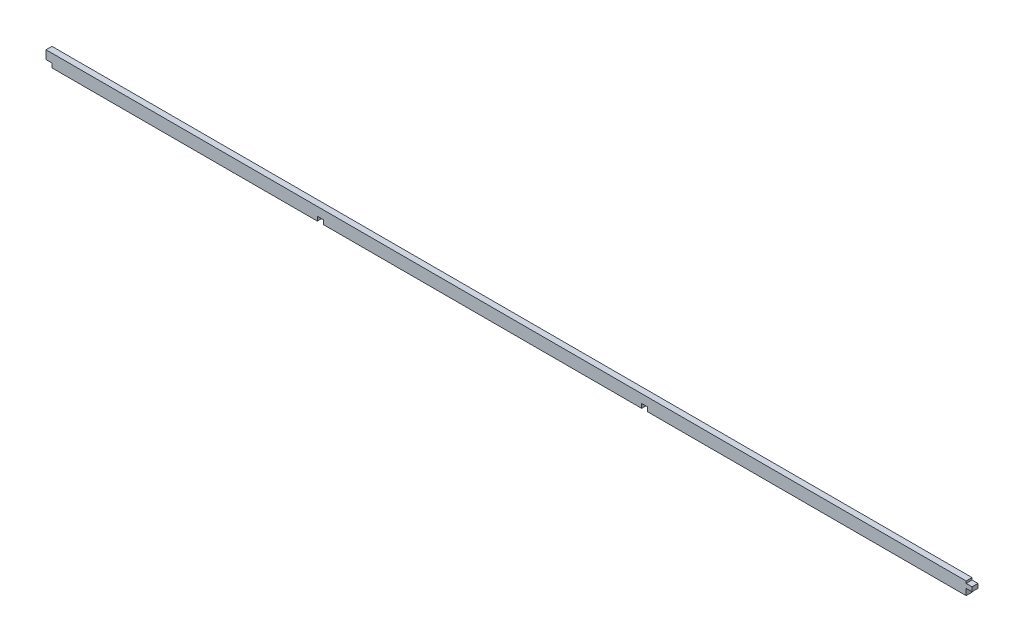
ISO-10303-21;
HEADER;
FILE_DESCRIPTION(('STEP AP214'),'2;1');
FILE_NAME('part.step','',(''),(''),'','','');
FILE_SCHEMA(('AUTOMOTIVE_DESIGN { 1 0 10303 214 1 1 1 1 }'));
ENDSEC;
DATA;
#1=APPLICATION_CONTEXT('core data for automotive mechanical design processes');
#2=APPLICATION_PROTOCOL_DEFINITION('international standard','automotive_design',2000,#1);
#3=PRODUCT_CONTEXT('',#1,'mechanical');
#4=PRODUCT('Part','Part','',(#3));
#5=PRODUCT_RELATED_PRODUCT_CATEGORY('part','',(#4));
#6=PRODUCT_DEFINITION_FORMATION('','',#4);
#7=PRODUCT_DEFINITION_CONTEXT('part definition',#1,'design');
#8=PRODUCT_DEFINITION('design','',#6,#7);
#9=PRODUCT_DEFINITION_SHAPE('','',#8);
#10=(LENGTH_UNIT() NAMED_UNIT(*) SI_UNIT(.MILLI.,.METRE.));
#11=(NAMED_UNIT(*) PLANE_ANGLE_UNIT() SI_UNIT($,.RADIAN.));
#12=(NAMED_UNIT(*) SI_UNIT($,.STERADIAN.) SOLID_ANGLE_UNIT());
#13=UNCERTAINTY_MEASURE_WITH_UNIT(LENGTH_MEASURE(1.E-05),#10,'distance_accuracy_value','');
#14=(GEOMETRIC_REPRESENTATION_CONTEXT(3) GLOBAL_UNCERTAINTY_ASSIGNED_CONTEXT((#13)) GLOBAL_UNIT_ASSIGNED_CONTEXT((#10,
#11,#12)) REPRESENTATION_CONTEXT('',''));
#15=CARTESIAN_POINT('',(0.,0.,0.));
#16=DIRECTION('',(0.,0.,1.));
#17=DIRECTION('',(1.,0.,0.));
#18=AXIS2_PLACEMENT_3D('',#15,#16,#17);
#19=CARTESIAN_POINT('',(433.4,0.,1.4));
#20=DIRECTION('',(-1.,0.,0.));
#21=DIRECTION('',(0.,0.,1.));
#22=AXIS2_PLACEMENT_3D('',#19,#20,#21);
#23=PLANE('',#22);
#24=DIRECTION('',(0.,1.,0.));
#25=VECTOR('',#24,1.);
#26=CARTESIAN_POINT('',(433.4,0.,-1.4));
#27=LINE('',#26,#25);
#28=CARTESIAN_POINT('',(433.4,-1.,-1.4));
#29=VERTEX_POINT('',#28);
#30=CARTESIAN_POINT('',(433.4,0.,-1.4));
#31=VERTEX_POINT('',#30);
#32=EDGE_CURVE('E188',#29,#31,#27,.T.);
#33=ORIENTED_EDGE('',*,*,#32,.T.);
#34=DIRECTION('',(0.,0.,-1.));
#35=VECTOR('',#34,1.);
#36=CARTESIAN_POINT('',(433.4,0.,1.4));
#37=LINE('',#36,#35);
#38=CARTESIAN_POINT('',(433.4,0.,1.4));
#39=VERTEX_POINT('',#38);
#40=EDGE_CURVE('E11',#39,#31,#37,.T.);
#41=ORIENTED_EDGE('',*,*,#40,.F.);
#42=DIRECTION('',(0.,1.,0.));
#43=VECTOR('',#42,1.);
#44=CARTESIAN_POINT('',(433.4,0.,1.4));
#45=LINE('',#44,#43);
#46=CARTESIAN_POINT('',(433.4,-1.,1.4));
#47=VERTEX_POINT('',#46);
#48=EDGE_CURVE('E222',#47,#39,#45,.T.);
#49=ORIENTED_EDGE('',*,*,#48,.F.);
#50=DIRECTION('',(0.,0.,-1.));
#51=VECTOR('',#50,1.);
#52=CARTESIAN_POINT('',(433.4,-1.,1.4));
#53=LINE('',#52,#51);
#54=EDGE_CURVE('E184',#47,#29,#53,.T.);
#55=ORIENTED_EDGE('',*,*,#54,.T.);
#56=EDGE_LOOP('',(#33,#41,#49,#55));
#57=FACE_BOUND('',#56,.T.);
#58=ADVANCED_FACE('F32',(#57),#23,.F.);
#59=CARTESIAN_POINT('',(0.,0.,1.4));
#60=DIRECTION('',(0.,-1.,0.));
#61=DIRECTION('',(0.,0.,-1.));
#62=AXIS2_PLACEMENT_3D('',#59,#60,#61);
#63=PLANE('',#62);
#64=DIRECTION('',(-1.,0.,0.));
#65=VECTOR('',#64,1.);
#66=CARTESIAN_POINT('',(0.,0.,-1.4));
#67=LINE('',#66,#65);
#68=CARTESIAN_POINT('',(0.,0.,-1.4));
#69=VERTEX_POINT('',#68);
#70=EDGE_CURVE('E191',#31,#69,#67,.T.);
#71=ORIENTED_EDGE('',*,*,#70,.T.);
#72=DIRECTION('',(0.,0.,-1.));
#73=VECTOR('',#72,1.);
#74=CARTESIAN_POINT('',(0.,0.,1.4));
#75=LINE('',#74,#73);
#76=CARTESIAN_POINT('',(0.,0.,1.4));
#77=VERTEX_POINT('',#76);
#78=EDGE_CURVE('E40',#77,#69,#75,.T.);
#79=ORIENTED_EDGE('',*,*,#78,.F.);
#80=DIRECTION('',(-1.,0.,0.));
#81=VECTOR('',#80,1.);
#82=CARTESIAN_POINT('',(0.,0.,1.4));
#83=LINE('',#82,#81);
#84=EDGE_CURVE('E121',#39,#77,#83,.T.);
#85=ORIENTED_EDGE('',*,*,#84,.F.);
#86=ORIENTED_EDGE('',*,*,#40,.T.);
#87=EDGE_LOOP('',(#71,#79,#85,#86));
#88=FACE_BOUND('',#87,.T.);
#89=ADVANCED_FACE('F330',(#88),#63,.F.);
#90=CARTESIAN_POINT('',(0.,-4.,1.4));
#91=DIRECTION('',(1.,0.,0.));
#92=DIRECTION('',(0.,0.,-1.));
#93=AXIS2_PLACEMENT_3D('',#90,#91,#92);
#94=PLANE('',#93);
#95=DIRECTION('',(0.,-1.,0.));
#96=VECTOR('',#95,1.);
#97=CARTESIAN_POINT('',(0.,-4.,-1.4));
#98=LINE('',#97,#96);
#99=CARTESIAN_POINT('',(0.,-4.,-1.4));
#100=VERTEX_POINT('',#99);
#101=EDGE_CURVE('E193',#69,#100,#98,.T.);
#102=ORIENTED_EDGE('',*,*,#101,.T.);
#103=DIRECTION('',(0.,0.,-1.));
#104=VECTOR('',#103,1.);
#105=CARTESIAN_POINT('',(0.,-4.,1.4));
#106=LINE('',#105,#104);
#107=CARTESIAN_POINT('',(0.,-4.,1.4));
#108=VERTEX_POINT('',#107);
#109=EDGE_CURVE('E259',#108,#100,#106,.T.);
#110=ORIENTED_EDGE('',*,*,#109,.F.);
#111=DIRECTION('',(0.,-1.,0.));
#112=VECTOR('',#111,1.);
#113=CARTESIAN_POINT('',(0.,-4.,1.4));
#114=LINE('',#113,#112);
#115=EDGE_CURVE('E267',#77,#108,#114,.T.);
#116=ORIENTED_EDGE('',*,*,#115,.F.);
#117=ORIENTED_EDGE('',*,*,#78,.T.);
#118=EDGE_LOOP('',(#102,#110,#116,#117));
#119=FACE_BOUND('',#118,.T.);
#120=ADVANCED_FACE('F265',(#119),#94,.F.);
#121=CARTESIAN_POINT('',(0.,-4.,1.4));
#122=DIRECTION('',(0.,1.,0.));
#123=DIRECTION('',(0.,0.,1.));
#124=AXIS2_PLACEMENT_3D('',#121,#122,#123);
#125=PLANE('',#124);
#126=DIRECTION('',(1.,0.,0.));
#127=VECTOR('',#126,1.);
#128=CARTESIAN_POINT('',(0.,-4.,-1.4));
#129=LINE('',#128,#127);
#130=CARTESIAN_POINT('',(2.80000000000002,-4.,-1.4));
#131=VERTEX_POINT('',#130);
#132=EDGE_CURVE('E195',#100,#131,#129,.T.);
#133=ORIENTED_EDGE('',*,*,#132,.T.);
#134=DIRECTION('',(0.,0.,-1.));
#135=VECTOR('',#134,1.);
#136=CARTESIAN_POINT('',(2.80000000000002,-4.,1.4));
#137=LINE('',#136,#135);
#138=CARTESIAN_POINT('',(2.80000000000002,-4.,1.4));
#139=VERTEX_POINT('',#138);
#140=EDGE_CURVE('E256',#139,#131,#137,.T.);
#141=ORIENTED_EDGE('',*,*,#140,.F.);
#142=DIRECTION('',(1.,0.,0.));
#143=VECTOR('',#142,1.);
#144=CARTESIAN_POINT('',(0.,-4.,1.4));
#145=LINE('',#144,#143);
#146=EDGE_CURVE('E285',#108,#139,#145,.T.);
#147=ORIENTED_EDGE('',*,*,#146,.F.);
#148=ORIENTED_EDGE('',*,*,#109,.T.);
#149=EDGE_LOOP('',(#133,#141,#147,#148));
#150=FACE_BOUND('',#149,.T.);
#151=ADVANCED_FACE('F276',(#150),#125,.F.);
#152=CARTESIAN_POINT('',(2.80000000000002,-4.,1.4));
#153=DIRECTION('',(1.,0.,0.));
#154=DIRECTION('',(0.,1.,0.));
#155=AXIS2_PLACEMENT_3D('',#152,#153,#154);
#156=PLANE('',#155);
#157=DIRECTION('',(0.,-1.,0.));
#158=VECTOR('',#157,1.);
#159=CARTESIAN_POINT('',(2.80000000000002,-4.,-1.4));
#160=LINE('',#159,#158);
#161=CARTESIAN_POINT('',(2.80000000000003,-6.,-1.4));
#162=VERTEX_POINT('',#161);
#163=EDGE_CURVE('E197',#131,#162,#160,.T.);
#164=ORIENTED_EDGE('',*,*,#163,.T.);
#165=DIRECTION('',(0.,0.,-1.));
#166=VECTOR('',#165,1.);
#167=CARTESIAN_POINT('',(2.80000000000003,-6.,1.4));
#168=LINE('',#167,#166);
#169=CARTESIAN_POINT('',(2.80000000000003,-6.,1.4));
#170=VERTEX_POINT('',#169);
#171=EDGE_CURVE('E253',#170,#162,#168,.T.);
#172=ORIENTED_EDGE('',*,*,#171,.F.);
#173=DIRECTION('',(0.,-1.,0.));
#174=VECTOR('',#173,1.);
#175=CARTESIAN_POINT('',(2.80000000000002,-4.,1.4));
#176=LINE('',#175,#174);
#177=EDGE_CURVE('E282',#139,#170,#176,.T.);
#178=ORIENTED_EDGE('',*,*,#177,.F.);
#179=ORIENTED_EDGE('',*,*,#140,.T.);
#180=EDGE_LOOP('',(#164,#172,#178,#179));
#181=FACE_BOUND('',#180,.T.);
#182=ADVANCED_FACE('F280',(#181),#156,.F.);
#183=CARTESIAN_POINT('',(2.80000000000003,-6.,1.4));
#184=DIRECTION('',(0.,1.,0.));
#185=DIRECTION('',(0.,0.,1.));
#186=AXIS2_PLACEMENT_3D('',#183,#184,#185);
#187=PLANE('',#186);
#188=DIRECTION('',(1.,0.,0.));
#189=VECTOR('',#188,1.);
#190=CARTESIAN_POINT('',(2.80000000000003,-6.,-1.4));
#191=LINE('',#190,#189);
#192=CARTESIAN_POINT('',(127.8,-6.,-1.4));
#193=VERTEX_POINT('',#192);
#194=EDGE_CURVE('E199',#162,#193,#191,.T.);
#195=ORIENTED_EDGE('',*,*,#194,.T.);
#196=DIRECTION('',(0.,0.,-1.));
#197=VECTOR('',#196,1.);
#198=CARTESIAN_POINT('',(127.8,-6.,1.4));
#199=LINE('',#198,#197);
#200=CARTESIAN_POINT('',(127.8,-6.,1.4));
#201=VERTEX_POINT('',#200);
#202=EDGE_CURVE('E250',#201,#193,#199,.T.);
#203=ORIENTED_EDGE('',*,*,#202,.F.);
#204=DIRECTION('',(1.,0.,0.));
#205=VECTOR('',#204,1.);
#206=CARTESIAN_POINT('',(2.80000000000003,-6.,1.4));
#207=LINE('',#206,#205);
#208=EDGE_CURVE('E284',#170,#201,#207,.T.);
#209=ORIENTED_EDGE('',*,*,#208,.F.);
#210=ORIENTED_EDGE('',*,*,#171,.T.);
#211=EDGE_LOOP('',(#195,#203,#209,#210));
#212=FACE_BOUND('',#211,.T.);
#213=ADVANCED_FACE('F343',(#212),#187,.F.);
#214=CARTESIAN_POINT('',(127.8,-6.,1.4));
#215=DIRECTION('',(-1.,0.,0.));
#216=DIRECTION('',(0.,0.,1.));
#217=AXIS2_PLACEMENT_3D('',#214,#215,#216);
#218=PLANE('',#217);
#219=DIRECTION('',(0.,1.,0.));
#220=VECTOR('',#219,1.);
#221=CARTESIAN_POINT('',(127.8,-6.,-1.4));
#222=LINE('',#221,#220);
#223=CARTESIAN_POINT('',(127.8,-4.,-1.4));
#224=VERTEX_POINT('',#223);
#225=EDGE_CURVE('E201',#193,#224,#222,.T.);
#226=ORIENTED_EDGE('',*,*,#225,.T.);
#227=DIRECTION('',(0.,0.,-1.));
#228=VECTOR('',#227,1.);
#229=CARTESIAN_POINT('',(127.8,-4.,1.4));
#230=LINE('',#229,#228);
#231=CARTESIAN_POINT('',(127.8,-4.,1.4));
#232=VERTEX_POINT('',#231);
#233=EDGE_CURVE('E247',#232,#224,#230,.T.);
#234=ORIENTED_EDGE('',*,*,#233,.F.);
#235=DIRECTION('',(0.,1.,0.));
#236=VECTOR('',#235,1.);
#237=CARTESIAN_POINT('',(127.8,-6.,1.4));
#238=LINE('',#237,#236);
#239=EDGE_CURVE('E287',#201,#232,#238,.T.);
#240=ORIENTED_EDGE('',*,*,#239,.F.);
#241=ORIENTED_EDGE('',*,*,#202,.T.);
#242=EDGE_LOOP('',(#226,#234,#240,#241));
#243=FACE_BOUND('',#242,.T.);
#244=ADVANCED_FACE('F346',(#243),#218,.F.);
#245=CARTESIAN_POINT('',(127.8,-4.,1.4));
#246=DIRECTION('',(0.,1.,0.));
#247=DIRECTION('',(0.,0.,1.));
#248=AXIS2_PLACEMENT_3D('',#245,#246,#247);
#249=PLANE('',#248);
#250=DIRECTION('',(1.,0.,0.));
#251=VECTOR('',#250,1.);
#252=CARTESIAN_POINT('',(127.8,-4.,-1.4));
#253=LINE('',#252,#251);
#254=CARTESIAN_POINT('',(130.6,-4.,-1.4));
#255=VERTEX_POINT('',#254);
#256=EDGE_CURVE('E203',#224,#255,#253,.T.);
#257=ORIENTED_EDGE('',*,*,#256,.T.);
#258=DIRECTION('',(0.,0.,-1.));
#259=VECTOR('',#258,1.);
#260=CARTESIAN_POINT('',(130.6,-4.,1.4));
#261=LINE('',#260,#259);
#262=CARTESIAN_POINT('',(130.6,-4.,1.4));
#263=VERTEX_POINT('',#262);
#264=EDGE_CURVE('E244',#263,#255,#261,.T.);
#265=ORIENTED_EDGE('',*,*,#264,.F.);
#266=DIRECTION('',(1.,0.,0.));
#267=VECTOR('',#266,1.);
#268=CARTESIAN_POINT('',(127.8,-4.,1.4));
#269=LINE('',#268,#267);
#270=EDGE_CURVE('E293',#232,#263,#269,.T.);
#271=ORIENTED_EDGE('',*,*,#270,.F.);
#272=ORIENTED_EDGE('',*,*,#233,.T.);
#273=EDGE_LOOP('',(#257,#265,#271,#272));
#274=FACE_BOUND('',#273,.T.);
#275=ADVANCED_FACE('F350',(#274),#249,.F.);
#276=CARTESIAN_POINT('',(130.6,-4.,1.4));
#277=DIRECTION('',(1.,0.,0.));
#278=DIRECTION('',(0.,0.,-1.));
#279=AXIS2_PLACEMENT_3D('',#276,#277,#278);
#280=PLANE('',#279);
#281=DIRECTION('',(0.,-1.,0.));
#282=VECTOR('',#281,1.);
#283=CARTESIAN_POINT('',(130.6,-4.,-1.4));
#284=LINE('',#283,#282);
#285=CARTESIAN_POINT('',(130.6,-6.,-1.4));
#286=VERTEX_POINT('',#285);
#287=EDGE_CURVE('E205',#255,#286,#284,.T.);
#288=ORIENTED_EDGE('',*,*,#287,.T.);
#289=DIRECTION('',(0.,0.,-1.));
#290=VECTOR('',#289,1.);
#291=CARTESIAN_POINT('',(130.6,-6.,1.4));
#292=LINE('',#291,#290);
#293=CARTESIAN_POINT('',(130.6,-6.,1.4));
#294=VERTEX_POINT('',#293);
#295=EDGE_CURVE('E241',#294,#286,#292,.T.);
#296=ORIENTED_EDGE('',*,*,#295,.F.);
#297=DIRECTION('',(0.,-1.,0.));
#298=VECTOR('',#297,1.);
#299=CARTESIAN_POINT('',(130.6,-4.,1.4));
#300=LINE('',#299,#298);
#301=EDGE_CURVE('E295',#263,#294,#300,.T.);
#302=ORIENTED_EDGE('',*,*,#301,.F.);
#303=ORIENTED_EDGE('',*,*,#264,.T.);
#304=EDGE_LOOP('',(#288,#296,#302,#303));
#305=FACE_BOUND('',#304,.T.);
#306=ADVANCED_FACE('F354',(#305),#280,.F.);
#307=CARTESIAN_POINT('',(130.6,-6.,1.4));
#308=DIRECTION('',(0.,1.,0.));
#309=DIRECTION('',(0.,0.,1.));
#310=AXIS2_PLACEMENT_3D('',#307,#308,#309);
#311=PLANE('',#310);
#312=DIRECTION('',(1.,0.,0.));
#313=VECTOR('',#312,1.);
#314=CARTESIAN_POINT('',(130.6,-6.,-1.4));
#315=LINE('',#314,#313);
#316=CARTESIAN_POINT('',(280.6,-6.,-1.4));
#317=VERTEX_POINT('',#316);
#318=EDGE_CURVE('E207',#286,#317,#315,.T.);
#319=ORIENTED_EDGE('',*,*,#318,.T.);
#320=DIRECTION('',(0.,0.,-1.));
#321=VECTOR('',#320,1.);
#322=CARTESIAN_POINT('',(280.6,-6.,1.4));
#323=LINE('',#322,#321);
#324=CARTESIAN_POINT('',(280.6,-6.,1.4));
#325=VERTEX_POINT('',#324);
#326=EDGE_CURVE('E238',#325,#317,#323,.T.);
#327=ORIENTED_EDGE('',*,*,#326,.F.);
#328=DIRECTION('',(1.,0.,0.));
#329=VECTOR('',#328,1.);
#330=CARTESIAN_POINT('',(130.6,-6.,1.4));
#331=LINE('',#330,#329);
#332=EDGE_CURVE('E297',#294,#325,#331,.T.);
#333=ORIENTED_EDGE('',*,*,#332,.F.);
#334=ORIENTED_EDGE('',*,*,#295,.T.);
#335=EDGE_LOOP('',(#319,#327,#333,#334));
#336=FACE_BOUND('',#335,.T.);
#337=ADVANCED_FACE('F358',(#336),#311,.F.);
#338=CARTESIAN_POINT('',(280.6,-6.,1.4));
#339=DIRECTION('',(-1.,0.,0.));
#340=DIRECTION('',(0.,0.,1.));
#341=AXIS2_PLACEMENT_3D('',#338,#339,#340);
#342=PLANE('',#341);
#343=DIRECTION('',(0.,1.,0.));
#344=VECTOR('',#343,1.);
#345=CARTESIAN_POINT('',(280.6,-6.,-1.4));
#346=LINE('',#345,#344);
#347=CARTESIAN_POINT('',(280.6,-4.,-1.4));
#348=VERTEX_POINT('',#347);
#349=EDGE_CURVE('E209',#317,#348,#346,.T.);
#350=ORIENTED_EDGE('',*,*,#349,.T.);
#351=DIRECTION('',(0.,0.,-1.));
#352=VECTOR('',#351,1.);
#353=CARTESIAN_POINT('',(280.6,-4.,1.4));
#354=LINE('',#353,#352);
#355=CARTESIAN_POINT('',(280.6,-4.,1.4));
#356=VERTEX_POINT('',#355);
#357=EDGE_CURVE('E235',#356,#348,#354,.T.);
#358=ORIENTED_EDGE('',*,*,#357,.F.);
#359=DIRECTION('',(0.,1.,0.));
#360=VECTOR('',#359,1.);
#361=CARTESIAN_POINT('',(280.6,-6.,1.4));
#362=LINE('',#361,#360);
#363=EDGE_CURVE('E299',#325,#356,#362,.T.);
#364=ORIENTED_EDGE('',*,*,#363,.F.);
#365=ORIENTED_EDGE('',*,*,#326,.T.);
#366=EDGE_LOOP('',(#350,#358,#364,#365));
#367=FACE_BOUND('',#366,.T.);
#368=ADVANCED_FACE('F362',(#367),#342,.F.);
#369=CARTESIAN_POINT('',(280.6,-4.,1.4));
#370=DIRECTION('',(0.,1.,0.));
#371=DIRECTION('',(-1.,0.,0.));
#372=AXIS2_PLACEMENT_3D('',#369,#370,#371);
#373=PLANE('',#372);
#374=DIRECTION('',(1.,0.,0.));
#375=VECTOR('',#374,1.);
#376=CARTESIAN_POINT('',(280.6,-4.,-1.4));
#377=LINE('',#376,#375);
#378=CARTESIAN_POINT('',(283.4,-4.,-1.4));
#379=VERTEX_POINT('',#378);
#380=EDGE_CURVE('E211',#348,#379,#377,.T.);
#381=ORIENTED_EDGE('',*,*,#380,.T.);
#382=DIRECTION('',(0.,0.,-1.));
#383=VECTOR('',#382,1.);
#384=CARTESIAN_POINT('',(283.4,-4.,1.4));
#385=LINE('',#384,#383);
#386=CARTESIAN_POINT('',(283.4,-4.,1.4));
#387=VERTEX_POINT('',#386);
#388=EDGE_CURVE('E232',#387,#379,#385,.T.);
#389=ORIENTED_EDGE('',*,*,#388,.F.);
#390=DIRECTION('',(1.,0.,0.));
#391=VECTOR('',#390,1.);
#392=CARTESIAN_POINT('',(280.6,-4.,1.4));
#393=LINE('',#392,#391);
#394=EDGE_CURVE('E301',#356,#387,#393,.T.);
#395=ORIENTED_EDGE('',*,*,#394,.F.);
#396=ORIENTED_EDGE('',*,*,#357,.T.);
#397=EDGE_LOOP('',(#381,#389,#395,#396));
#398=FACE_BOUND('',#397,.T.);
#399=ADVANCED_FACE('F366',(#398),#373,.F.);
#400=CARTESIAN_POINT('',(283.4,-4.,1.4));
#401=DIRECTION('',(1.,0.,0.));
#402=DIRECTION('',(0.,0.,-1.));
#403=AXIS2_PLACEMENT_3D('',#400,#401,#402);
#404=PLANE('',#403);
#405=DIRECTION('',(0.,-1.,0.));
#406=VECTOR('',#405,1.);
#407=CARTESIAN_POINT('',(283.4,-4.,-1.4));
#408=LINE('',#407,#406);
#409=CARTESIAN_POINT('',(283.4,-6.,-1.4));
#410=VERTEX_POINT('',#409);
#411=EDGE_CURVE('E213',#379,#410,#408,.T.);
#412=ORIENTED_EDGE('',*,*,#411,.T.);
#413=DIRECTION('',(0.,0.,-1.));
#414=VECTOR('',#413,1.);
#415=CARTESIAN_POINT('',(283.4,-6.,1.4));
#416=LINE('',#415,#414);
#417=CARTESIAN_POINT('',(283.4,-6.,1.4));
#418=VERTEX_POINT('',#417);
#419=EDGE_CURVE('E229',#418,#410,#416,.T.);
#420=ORIENTED_EDGE('',*,*,#419,.F.);
#421=DIRECTION('',(0.,-1.,0.));
#422=VECTOR('',#421,1.);
#423=CARTESIAN_POINT('',(283.4,-4.,1.4));
#424=LINE('',#423,#422);
#425=EDGE_CURVE('E303',#387,#418,#424,.T.);
#426=ORIENTED_EDGE('',*,*,#425,.F.);
#427=ORIENTED_EDGE('',*,*,#388,.T.);
#428=EDGE_LOOP('',(#412,#420,#426,#427));
#429=FACE_BOUND('',#428,.T.);
#430=ADVANCED_FACE('F370',(#429),#404,.F.);
#431=CARTESIAN_POINT('',(283.4,-6.,1.4));
#432=DIRECTION('',(0.,1.,0.));
#433=DIRECTION('',(0.,0.,1.));
#434=AXIS2_PLACEMENT_3D('',#431,#432,#433);
#435=PLANE('',#434);
#436=DIRECTION('',(1.,0.,0.));
#437=VECTOR('',#436,1.);
#438=CARTESIAN_POINT('',(283.4,-6.,-1.4));
#439=LINE('',#438,#437);
#440=CARTESIAN_POINT('',(433.4,-6.,-1.4));
#441=VERTEX_POINT('',#440);
#442=EDGE_CURVE('E215',#410,#441,#439,.T.);
#443=ORIENTED_EDGE('',*,*,#442,.T.);
#444=DIRECTION('',(0.,0.,-1.));
#445=VECTOR('',#444,1.);
#446=CARTESIAN_POINT('',(433.4,-6.,1.4));
#447=LINE('',#446,#445);
#448=CARTESIAN_POINT('',(433.4,-6.,1.4));
#449=VERTEX_POINT('',#448);
#450=EDGE_CURVE('E226',#449,#441,#447,.T.);
#451=ORIENTED_EDGE('',*,*,#450,.F.);
#452=DIRECTION('',(1.,0.,0.));
#453=VECTOR('',#452,1.);
#454=CARTESIAN_POINT('',(283.4,-6.,1.4));
#455=LINE('',#454,#453);
#456=EDGE_CURVE('E305',#418,#449,#455,.T.);
#457=ORIENTED_EDGE('',*,*,#456,.F.);
#458=ORIENTED_EDGE('',*,*,#419,.T.);
#459=EDGE_LOOP('',(#443,#451,#457,#458));
#460=FACE_BOUND('',#459,.T.);
#461=ADVANCED_FACE('F311',(#460),#435,.F.);
#462=CARTESIAN_POINT('',(433.4,-3.,1.4));
#463=DIRECTION('',(-1.,0.,0.));
#464=DIRECTION('',(0.,0.,1.));
#465=AXIS2_PLACEMENT_3D('',#462,#463,#464);
#466=PLANE('',#465);
#467=DIRECTION('',(0.,1.,0.));
#468=VECTOR('',#467,1.);
#469=CARTESIAN_POINT('',(433.4,-3.,-1.4));
#470=LINE('',#469,#468);
#471=CARTESIAN_POINT('',(433.4,-3.,-1.4));
#472=VERTEX_POINT('',#471);
#473=EDGE_CURVE('E217',#441,#472,#470,.T.);
#474=ORIENTED_EDGE('',*,*,#473,.T.);
#475=DIRECTION('',(0.,0.,-1.));
#476=VECTOR('',#475,1.);
#477=CARTESIAN_POINT('',(433.4,-3.,1.4));
#478=LINE('',#477,#476);
#479=CARTESIAN_POINT('',(433.4,-3.,1.4));
#480=VERTEX_POINT('',#479);
#481=EDGE_CURVE('E179',#480,#472,#478,.T.);
#482=ORIENTED_EDGE('',*,*,#481,.F.);
#483=DIRECTION('',(0.,1.,0.));
#484=VECTOR('',#483,1.);
#485=CARTESIAN_POINT('',(433.4,-3.,1.4));
#486=LINE('',#485,#484);
#487=EDGE_CURVE('E170',#449,#480,#486,.T.);
#488=ORIENTED_EDGE('',*,*,#487,.F.);
#489=ORIENTED_EDGE('',*,*,#450,.T.);
#490=EDGE_LOOP('',(#474,#482,#488,#489));
#491=FACE_BOUND('',#490,.T.);
#492=ADVANCED_FACE('F315',(#491),#466,.F.);
#493=CARTESIAN_POINT('',(433.4,-3.,1.4));
#494=DIRECTION('',(0.,1.,0.));
#495=DIRECTION('',(0.,0.,1.));
#496=AXIS2_PLACEMENT_3D('',#493,#494,#495);
#497=PLANE('',#496);
#498=DIRECTION('',(1.,0.,0.));
#499=VECTOR('',#498,1.);
#500=CARTESIAN_POINT('',(433.4,-3.,-1.4));
#501=LINE('',#500,#499);
#502=CARTESIAN_POINT('',(436.2,-3.,-1.4));
#503=VERTEX_POINT('',#502);
#504=EDGE_CURVE('E178',#472,#503,#501,.T.);
#505=ORIENTED_EDGE('',*,*,#504,.T.);
#506=DIRECTION('',(0.,0.,-1.));
#507=VECTOR('',#506,1.);
#508=CARTESIAN_POINT('',(436.2,-3.,1.4));
#509=LINE('',#508,#507);
#510=CARTESIAN_POINT('',(436.2,-3.,1.4));
#511=VERTEX_POINT('',#510);
#512=EDGE_CURVE('E175',#511,#503,#509,.T.);
#513=ORIENTED_EDGE('',*,*,#512,.F.);
#514=DIRECTION('',(1.,0.,0.));
#515=VECTOR('',#514,1.);
#516=CARTESIAN_POINT('',(433.4,-3.,1.4));
#517=LINE('',#516,#515);
#518=EDGE_CURVE('E164',#480,#511,#517,.T.);
#519=ORIENTED_EDGE('',*,*,#518,.F.);
#520=ORIENTED_EDGE('',*,*,#481,.T.);
#521=EDGE_LOOP('',(#505,#513,#519,#520));
#522=FACE_BOUND('',#521,.T.);
#523=ADVANCED_FACE('F176',(#522),#497,.F.);
#524=CARTESIAN_POINT('',(436.2,-3.,1.4));
#525=DIRECTION('',(-1.,0.,0.));
#526=DIRECTION('',(0.,0.,1.));
#527=AXIS2_PLACEMENT_3D('',#524,#525,#526);
#528=PLANE('',#527);
#529=DIRECTION('',(0.,1.,0.));
#530=VECTOR('',#529,1.);
#531=CARTESIAN_POINT('',(436.2,-3.,-1.4));
#532=LINE('',#531,#530);
#533=CARTESIAN_POINT('',(436.2,-1.,-1.4));
#534=VERTEX_POINT('',#533);
#535=EDGE_CURVE('E107',#503,#534,#532,.T.);
#536=ORIENTED_EDGE('',*,*,#535,.T.);
#537=DIRECTION('',(0.,0.,-1.));
#538=VECTOR('',#537,1.);
#539=CARTESIAN_POINT('',(436.2,-1.,1.4));
#540=LINE('',#539,#538);
#541=CARTESIAN_POINT('',(436.2,-1.,1.4));
#542=VERTEX_POINT('',#541);
#543=EDGE_CURVE('E180',#542,#534,#540,.T.);
#544=ORIENTED_EDGE('',*,*,#543,.F.);
#545=DIRECTION('',(0.,1.,0.));
#546=VECTOR('',#545,1.);
#547=CARTESIAN_POINT('',(436.2,-3.,1.4));
#548=LINE('',#547,#546);
#549=EDGE_CURVE('E168',#511,#542,#548,.T.);
#550=ORIENTED_EDGE('',*,*,#549,.F.);
#551=ORIENTED_EDGE('',*,*,#512,.T.);
#552=EDGE_LOOP('',(#536,#544,#550,#551));
#553=FACE_BOUND('',#552,.T.);
#554=ADVANCED_FACE('F182',(#553),#528,.F.);
#555=CARTESIAN_POINT('',(433.4,-1.,1.4));
#556=DIRECTION('',(0.,-1.,0.));
#557=DIRECTION('',(0.,0.,-1.));
#558=AXIS2_PLACEMENT_3D('',#555,#556,#557);
#559=PLANE('',#558);
#560=DIRECTION('',(-1.,0.,0.));
#561=VECTOR('',#560,1.);
#562=CARTESIAN_POINT('',(433.4,-1.,-1.4));
#563=LINE('',#562,#561);
#564=EDGE_CURVE('E113',#534,#29,#563,.T.);
#565=ORIENTED_EDGE('',*,*,#564,.T.);
#566=ORIENTED_EDGE('',*,*,#54,.F.);
#567=DIRECTION('',(-1.,0.,0.));
#568=VECTOR('',#567,1.);
#569=CARTESIAN_POINT('',(433.4,-1.,1.4));
#570=LINE('',#569,#568);
#571=EDGE_CURVE('E48',#542,#47,#570,.T.);
#572=ORIENTED_EDGE('',*,*,#571,.F.);
#573=ORIENTED_EDGE('',*,*,#543,.T.);
#574=EDGE_LOOP('',(#565,#566,#572,#573));
#575=FACE_BOUND('',#574,.T.);
#576=ADVANCED_FACE('F319',(#575),#559,.F.);
#577=CARTESIAN_POINT('',(0.,0.,1.4));
#578=DIRECTION('',(0.,0.,1.));
#579=DIRECTION('',(1.,0.,0.));
#580=AXIS2_PLACEMENT_3D('',#577,#578,#579);
#581=PLANE('',#580);
#582=ORIENTED_EDGE('',*,*,#48,.T.);
#583=ORIENTED_EDGE('',*,*,#84,.T.);
#584=ORIENTED_EDGE('',*,*,#115,.T.);
#585=ORIENTED_EDGE('',*,*,#146,.T.);
#586=ORIENTED_EDGE('',*,*,#177,.T.);
#587=ORIENTED_EDGE('',*,*,#208,.T.);
#588=ORIENTED_EDGE('',*,*,#239,.T.);
#589=ORIENTED_EDGE('',*,*,#270,.T.);
#590=ORIENTED_EDGE('',*,*,#301,.T.);
#591=ORIENTED_EDGE('',*,*,#332,.T.);
#592=ORIENTED_EDGE('',*,*,#363,.T.);
#593=ORIENTED_EDGE('',*,*,#394,.T.);
#594=ORIENTED_EDGE('',*,*,#425,.T.);
#595=ORIENTED_EDGE('',*,*,#456,.T.);
#596=ORIENTED_EDGE('',*,*,#487,.T.);
#597=ORIENTED_EDGE('',*,*,#518,.T.);
#598=ORIENTED_EDGE('',*,*,#549,.T.);
#599=ORIENTED_EDGE('',*,*,#571,.T.);
#600=EDGE_LOOP('',(#582,#583,#584,#585,#586,#587,#588,#589,#590,#591,#592,#593,#594,#595,#596,
#597,#598,#599));
#601=FACE_BOUND('',#600,.T.);
#602=ADVANCED_FACE('F166',(#601),#581,.T.);
#603=CARTESIAN_POINT('',(0.,0.,-1.4));
#604=DIRECTION('',(0.,0.,1.));
#605=DIRECTION('',(1.,0.,0.));
#606=AXIS2_PLACEMENT_3D('',#603,#604,#605);
#607=PLANE('',#606);
#608=ORIENTED_EDGE('',*,*,#32,.F.);
#609=ORIENTED_EDGE('',*,*,#564,.F.);
#610=ORIENTED_EDGE('',*,*,#535,.F.);
#611=ORIENTED_EDGE('',*,*,#504,.F.);
#612=ORIENTED_EDGE('',*,*,#473,.F.);
#613=ORIENTED_EDGE('',*,*,#442,.F.);
#614=ORIENTED_EDGE('',*,*,#411,.F.);
#615=ORIENTED_EDGE('',*,*,#380,.F.);
#616=ORIENTED_EDGE('',*,*,#349,.F.);
#617=ORIENTED_EDGE('',*,*,#318,.F.);
#618=ORIENTED_EDGE('',*,*,#287,.F.);
#619=ORIENTED_EDGE('',*,*,#256,.F.);
#620=ORIENTED_EDGE('',*,*,#225,.F.);
#621=ORIENTED_EDGE('',*,*,#194,.F.);
#622=ORIENTED_EDGE('',*,*,#163,.F.);
#623=ORIENTED_EDGE('',*,*,#132,.F.);
#624=ORIENTED_EDGE('',*,*,#101,.F.);
#625=ORIENTED_EDGE('',*,*,#70,.F.);
#626=EDGE_LOOP('',(#608,#609,#610,#611,#612,#613,#614,#615,#616,#617,#618,#619,#620,#621,#622,
#623,#624,#625));
#627=FACE_BOUND('',#626,.T.);
#628=ADVANCED_FACE('F271',(#627),#607,.F.);
#629=CLOSED_SHELL('',(#58,#89,#120,#151,#182,#213,#244,#275,#306,#337,#368,#399,#430,#461,#492,
#523,#554,#576,#602,#628));
#630=MANIFOLD_SOLID_BREP('B2',#629);
#631=ADVANCED_BREP_SHAPE_REPRESENTATION('',(#18,#630),#14);
#632=SHAPE_DEFINITION_REPRESENTATION(#9,#631);
ENDSEC;
END-ISO-10303-21;
